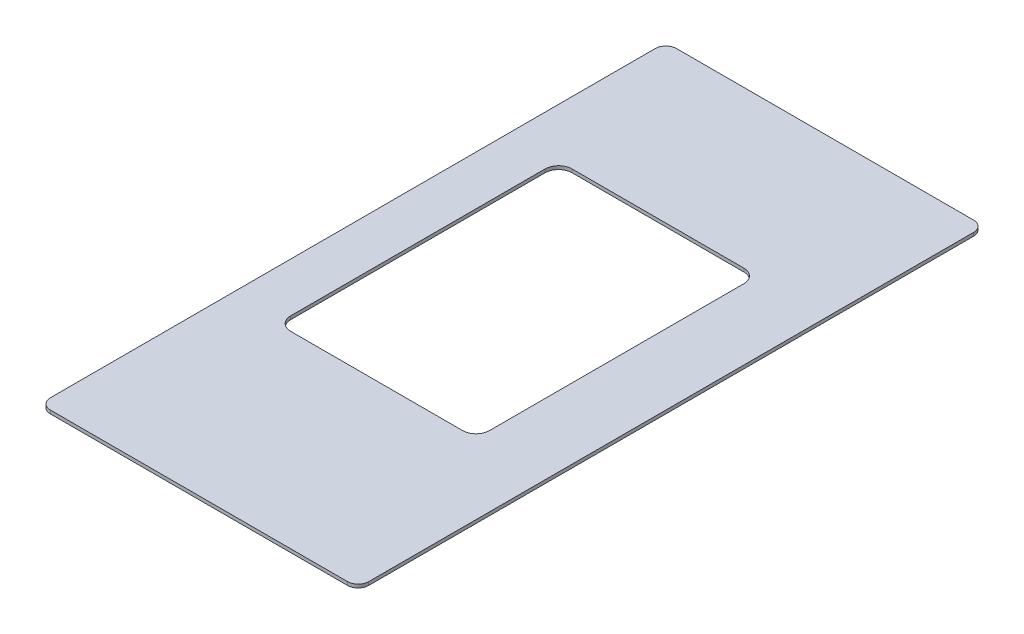
ISO-10303-21;
HEADER;
FILE_DESCRIPTION(('STEP AP214'),'2;1');
FILE_NAME('part.step','',(''),(''),'','','');
FILE_SCHEMA(('AUTOMOTIVE_DESIGN { 1 0 10303 214 1 1 1 1 }'));
ENDSEC;
DATA;
#1=APPLICATION_CONTEXT('core data for automotive mechanical design processes');
#2=APPLICATION_PROTOCOL_DEFINITION('international standard','automotive_design',2000,#1);
#3=PRODUCT_CONTEXT('',#1,'mechanical');
#4=PRODUCT('Part','Part','',(#3));
#5=PRODUCT_RELATED_PRODUCT_CATEGORY('part','',(#4));
#6=PRODUCT_DEFINITION_FORMATION('','',#4);
#7=PRODUCT_DEFINITION_CONTEXT('part definition',#1,'design');
#8=PRODUCT_DEFINITION('design','',#6,#7);
#9=PRODUCT_DEFINITION_SHAPE('','',#8);
#10=(LENGTH_UNIT() NAMED_UNIT(*) SI_UNIT(.MILLI.,.METRE.));
#11=(NAMED_UNIT(*) PLANE_ANGLE_UNIT() SI_UNIT($,.RADIAN.));
#12=(NAMED_UNIT(*) SI_UNIT($,.STERADIAN.) SOLID_ANGLE_UNIT());
#13=UNCERTAINTY_MEASURE_WITH_UNIT(LENGTH_MEASURE(1.E-05),#10,'distance_accuracy_value','');
#14=(GEOMETRIC_REPRESENTATION_CONTEXT(3) GLOBAL_UNCERTAINTY_ASSIGNED_CONTEXT((#13)) GLOBAL_UNIT_ASSIGNED_CONTEXT((#10,
#11,#12)) REPRESENTATION_CONTEXT('',''));
#15=CARTESIAN_POINT('',(0.,0.,0.));
#16=DIRECTION('',(0.,0.,1.));
#17=DIRECTION('',(1.,0.,0.));
#18=AXIS2_PLACEMENT_3D('',#15,#16,#17);
#19=CARTESIAN_POINT('',(0.,3.175,-157.44375));
#20=DIRECTION('',(0.,0.,1.));
#21=DIRECTION('',(1.,0.,0.));
#22=AXIS2_PLACEMENT_3D('',#19,#20,#21);
#23=PLANE('',#22);
#24=DIRECTION('',(-1.,0.,0.));
#25=VECTOR('',#24,1.);
#26=CARTESIAN_POINT('',(0.,0.,-157.44375));
#27=LINE('',#26,#25);
#28=CARTESIAN_POINT('',(70.9624999999999,0.,-157.44375));
#29=VERTEX_POINT('',#28);
#30=CARTESIAN_POINT('',(-90.9625000000001,0.,-157.44375));
#31=VERTEX_POINT('',#30);
#32=EDGE_CURVE('E189',#29,#31,#27,.T.);
#33=ORIENTED_EDGE('',*,*,#32,.T.);
#34=DIRECTION('',(0.,-1.,0.));
#35=VECTOR('',#34,1.);
#36=CARTESIAN_POINT('',(-90.9625000000001,3.175,-157.44375));
#37=LINE('',#36,#35);
#38=CARTESIAN_POINT('',(-90.9625000000001,3.175,-157.44375));
#39=VERTEX_POINT('',#38);
#40=EDGE_CURVE('E236',#31,#39,#37,.F.);
#41=ORIENTED_EDGE('',*,*,#40,.T.);
#42=DIRECTION('',(-1.,0.,0.));
#43=VECTOR('',#42,1.);
#44=CARTESIAN_POINT('',(0.,3.175,-157.44375));
#45=LINE('',#44,#43);
#46=CARTESIAN_POINT('',(70.9624999999999,3.175,-157.44375));
#47=VERTEX_POINT('',#46);
#48=EDGE_CURVE('E273',#47,#39,#45,.T.);
#49=ORIENTED_EDGE('',*,*,#48,.F.);
#50=DIRECTION('',(0.,-1.,0.));
#51=VECTOR('',#50,1.);
#52=CARTESIAN_POINT('',(70.9624999999999,3.175,-157.44375));
#53=LINE('',#52,#51);
#54=EDGE_CURVE('E233',#47,#29,#53,.T.);
#55=ORIENTED_EDGE('',*,*,#54,.T.);
#56=EDGE_LOOP('',(#33,#41,#49,#55));
#57=FACE_BOUND('',#56,.T.);
#58=ADVANCED_FACE('F37',(#57),#23,.F.);
#59=CARTESIAN_POINT('',(-103.6625,3.175,0.));
#60=DIRECTION('',(-1.,0.,0.));
#61=DIRECTION('',(0.,0.,1.));
#62=AXIS2_PLACEMENT_3D('',#59,#60,#61);
#63=PLANE('',#62);
#64=DIRECTION('',(0.,0.,-1.));
#65=VECTOR('',#64,1.);
#66=CARTESIAN_POINT('',(-103.6625,3.175,0.));
#67=LINE('',#66,#65);
#68=CARTESIAN_POINT('',(-103.6625,3.175,-170.14375));
#69=VERTEX_POINT('',#68);
#70=CARTESIAN_POINT('',(-103.6625,3.175,-409.85625));
#71=VERTEX_POINT('',#70);
#72=EDGE_CURVE('E270',#69,#71,#67,.T.);
#73=ORIENTED_EDGE('',*,*,#72,.F.);
#74=DIRECTION('',(0.,-1.,0.));
#75=VECTOR('',#74,1.);
#76=CARTESIAN_POINT('',(-103.6625,0.,-170.14375));
#77=LINE('',#76,#75);
#78=CARTESIAN_POINT('',(-103.6625,0.,-170.14375));
#79=VERTEX_POINT('',#78);
#80=EDGE_CURVE('E230',#69,#79,#77,.T.);
#81=ORIENTED_EDGE('',*,*,#80,.T.);
#82=DIRECTION('',(0.,0.,-1.));
#83=VECTOR('',#82,1.);
#84=CARTESIAN_POINT('',(-103.6625,0.,0.));
#85=LINE('',#84,#83);
#86=CARTESIAN_POINT('',(-103.6625,0.,-409.85625));
#87=VERTEX_POINT('',#86);
#88=EDGE_CURVE('E192',#79,#87,#85,.T.);
#89=ORIENTED_EDGE('',*,*,#88,.T.);
#90=DIRECTION('',(0.,-1.,0.));
#91=VECTOR('',#90,1.);
#92=CARTESIAN_POINT('',(-103.6625,3.175,-409.85625));
#93=LINE('',#92,#91);
#94=EDGE_CURVE('E228',#87,#71,#93,.F.);
#95=ORIENTED_EDGE('',*,*,#94,.T.);
#96=EDGE_LOOP('',(#73,#81,#89,#95));
#97=FACE_BOUND('',#96,.T.);
#98=ADVANCED_FACE('F265',(#97),#63,.F.);
#99=CARTESIAN_POINT('',(-1.25218651527896E-13,3.175,-422.55625));
#100=DIRECTION('',(0.,0.,1.));
#101=DIRECTION('',(1.,0.,0.));
#102=AXIS2_PLACEMENT_3D('',#99,#100,#101);
#103=PLANE('',#102);
#104=DIRECTION('',(-1.,0.,0.));
#105=VECTOR('',#104,1.);
#106=CARTESIAN_POINT('',(-1.25218651527896E-13,0.,-422.55625));
#107=LINE('',#106,#105);
#108=CARTESIAN_POINT('',(70.9624999999999,0.,-422.55625));
#109=VERTEX_POINT('',#108);
#110=CARTESIAN_POINT('',(-90.9625000000001,0.,-422.55625));
#111=VERTEX_POINT('',#110);
#112=EDGE_CURVE('E195',#109,#111,#107,.T.);
#113=ORIENTED_EDGE('',*,*,#112,.F.);
#114=DIRECTION('',(0.,-1.,0.));
#115=VECTOR('',#114,1.);
#116=CARTESIAN_POINT('',(70.9624999999999,3.175,-422.55625));
#117=LINE('',#116,#115);
#118=CARTESIAN_POINT('',(70.9624999999999,3.175,-422.55625));
#119=VERTEX_POINT('',#118);
#120=EDGE_CURVE('E57',#109,#119,#117,.F.);
#121=ORIENTED_EDGE('',*,*,#120,.T.);
#122=DIRECTION('',(-1.,0.,0.));
#123=VECTOR('',#122,1.);
#124=CARTESIAN_POINT('',(-1.25218651527896E-13,3.175,-422.55625));
#125=LINE('',#124,#123);
#126=CARTESIAN_POINT('',(-90.9625000000001,3.175,-422.55625));
#127=VERTEX_POINT('',#126);
#128=EDGE_CURVE('E268',#119,#127,#125,.T.);
#129=ORIENTED_EDGE('',*,*,#128,.T.);
#130=DIRECTION('',(0.,-1.,0.));
#131=VECTOR('',#130,1.);
#132=CARTESIAN_POINT('',(-90.9625000000001,3.175,-422.55625));
#133=LINE('',#132,#131);
#134=EDGE_CURVE('E243',#127,#111,#133,.T.);
#135=ORIENTED_EDGE('',*,*,#134,.T.);
#136=EDGE_LOOP('',(#113,#121,#129,#135));
#137=FACE_BOUND('',#136,.T.);
#138=ADVANCED_FACE('F267',(#137),#103,.T.);
#139=CARTESIAN_POINT('',(0.,3.175,-570.));
#140=DIRECTION('',(0.,0.,-1.));
#141=DIRECTION('',(-1.,0.,0.));
#142=AXIS2_PLACEMENT_3D('',#139,#140,#141);
#143=PLANE('',#142);
#144=DIRECTION('',(1.,0.,0.));
#145=VECTOR('',#144,1.);
#146=CARTESIAN_POINT('',(0.,0.,-570.));
#147=LINE('',#146,#145);
#148=CARTESIAN_POINT('',(-140.,0.,-570.));
#149=VERTEX_POINT('',#148);
#150=CARTESIAN_POINT('',(140.,0.,-570.));
#151=VERTEX_POINT('',#150);
#152=EDGE_CURVE('E179',#149,#151,#147,.T.);
#153=ORIENTED_EDGE('',*,*,#152,.F.);
#154=DIRECTION('',(0.,-1.,0.));
#155=VECTOR('',#154,1.);
#156=CARTESIAN_POINT('',(-140.,3.175,-570.));
#157=LINE('',#156,#155);
#158=CARTESIAN_POINT('',(-140.,3.175,-570.));
#159=VERTEX_POINT('',#158);
#160=EDGE_CURVE('E155',#149,#159,#157,.F.);
#161=ORIENTED_EDGE('',*,*,#160,.T.);
#162=DIRECTION('',(1.,0.,0.));
#163=VECTOR('',#162,1.);
#164=CARTESIAN_POINT('',(0.,3.175,-570.));
#165=LINE('',#164,#163);
#166=CARTESIAN_POINT('',(140.,3.175,-570.));
#167=VERTEX_POINT('',#166);
#168=EDGE_CURVE('E201',#159,#167,#165,.T.);
#169=ORIENTED_EDGE('',*,*,#168,.T.);
#170=DIRECTION('',(0.,-1.,0.));
#171=VECTOR('',#170,1.);
#172=CARTESIAN_POINT('',(140.,3.175,-570.));
#173=LINE('',#172,#171);
#174=EDGE_CURVE('E160',#167,#151,#173,.T.);
#175=ORIENTED_EDGE('',*,*,#174,.T.);
#176=EDGE_LOOP('',(#153,#161,#169,#175));
#177=FACE_BOUND('',#176,.T.);
#178=ADVANCED_FACE('F289',(#177),#143,.T.);
#179=CARTESIAN_POINT('',(-150.,3.175,0.));
#180=DIRECTION('',(1.,0.,0.));
#181=DIRECTION('',(0.,0.,-1.));
#182=AXIS2_PLACEMENT_3D('',#179,#180,#181);
#183=PLANE('',#182);
#184=DIRECTION('',(0.,0.,1.));
#185=VECTOR('',#184,1.);
#186=CARTESIAN_POINT('',(-150.,3.175,0.));
#187=LINE('',#186,#185);
#188=CARTESIAN_POINT('',(-150.,3.175,-560.));
#189=VERTEX_POINT('',#188);
#190=CARTESIAN_POINT('',(-150.,3.175,10.));
#191=VERTEX_POINT('',#190);
#192=EDGE_CURVE('E170',#189,#191,#187,.T.);
#193=ORIENTED_EDGE('',*,*,#192,.F.);
#194=DIRECTION('',(0.,-1.,0.));
#195=VECTOR('',#194,1.);
#196=CARTESIAN_POINT('',(-150.,0.,-560.));
#197=LINE('',#196,#195);
#198=CARTESIAN_POINT('',(-150.,0.,-560.));
#199=VERTEX_POINT('',#198);
#200=EDGE_CURVE('E154',#189,#199,#197,.T.);
#201=ORIENTED_EDGE('',*,*,#200,.T.);
#202=DIRECTION('',(0.,0.,1.));
#203=VECTOR('',#202,1.);
#204=CARTESIAN_POINT('',(-150.,0.,0.));
#205=LINE('',#204,#203);
#206=CARTESIAN_POINT('',(-150.,0.,10.));
#207=VERTEX_POINT('',#206);
#208=EDGE_CURVE('E167',#199,#207,#205,.T.);
#209=ORIENTED_EDGE('',*,*,#208,.T.);
#210=DIRECTION('',(0.,-1.,0.));
#211=VECTOR('',#210,1.);
#212=CARTESIAN_POINT('',(-150.,3.175,10.));
#213=LINE('',#212,#211);
#214=EDGE_CURVE('E172',#207,#191,#213,.F.);
#215=ORIENTED_EDGE('',*,*,#214,.T.);
#216=EDGE_LOOP('',(#193,#201,#209,#215));
#217=FACE_BOUND('',#216,.T.);
#218=ADVANCED_FACE('F166',(#217),#183,.F.);
#219=CARTESIAN_POINT('',(0.,3.175,20.));
#220=DIRECTION('',(0.,0.,-1.));
#221=DIRECTION('',(-1.,0.,0.));
#222=AXIS2_PLACEMENT_3D('',#219,#220,#221);
#223=PLANE('',#222);
#224=DIRECTION('',(1.,0.,0.));
#225=VECTOR('',#224,1.);
#226=CARTESIAN_POINT('',(0.,3.175,20.));
#227=LINE('',#226,#225);
#228=CARTESIAN_POINT('',(-140.,3.175,20.));
#229=VERTEX_POINT('',#228);
#230=CARTESIAN_POINT('',(140.,3.175,20.));
#231=VERTEX_POINT('',#230);
#232=EDGE_CURVE('E281',#229,#231,#227,.T.);
#233=ORIENTED_EDGE('',*,*,#232,.F.);
#234=DIRECTION('',(0.,-1.,0.));
#235=VECTOR('',#234,1.);
#236=CARTESIAN_POINT('',(-140.,3.175,20.));
#237=LINE('',#236,#235);
#238=CARTESIAN_POINT('',(-140.,0.,20.));
#239=VERTEX_POINT('',#238);
#240=EDGE_CURVE('E225',#229,#239,#237,.T.);
#241=ORIENTED_EDGE('',*,*,#240,.T.);
#242=DIRECTION('',(1.,0.,0.));
#243=VECTOR('',#242,1.);
#244=CARTESIAN_POINT('',(0.,0.,20.));
#245=LINE('',#244,#243);
#246=CARTESIAN_POINT('',(140.,0.,20.));
#247=VERTEX_POINT('',#246);
#248=EDGE_CURVE('E178',#239,#247,#245,.T.);
#249=ORIENTED_EDGE('',*,*,#248,.T.);
#250=DIRECTION('',(0.,-1.,0.));
#251=VECTOR('',#250,1.);
#252=CARTESIAN_POINT('',(140.,3.175,20.));
#253=LINE('',#252,#251);
#254=EDGE_CURVE('E223',#247,#231,#253,.F.);
#255=ORIENTED_EDGE('',*,*,#254,.T.);
#256=EDGE_LOOP('',(#233,#241,#249,#255));
#257=FACE_BOUND('',#256,.T.);
#258=ADVANCED_FACE('F306',(#257),#223,.F.);
#259=CARTESIAN_POINT('',(150.,3.175,0.));
#260=DIRECTION('',(1.,0.,0.));
#261=DIRECTION('',(0.,0.,-1.));
#262=AXIS2_PLACEMENT_3D('',#259,#260,#261);
#263=PLANE('',#262);
#264=DIRECTION('',(0.,0.,1.));
#265=VECTOR('',#264,1.);
#266=CARTESIAN_POINT('',(150.,0.,0.));
#267=LINE('',#266,#265);
#268=CARTESIAN_POINT('',(150.,0.,-560.));
#269=VERTEX_POINT('',#268);
#270=CARTESIAN_POINT('',(150.,0.,10.));
#271=VERTEX_POINT('',#270);
#272=EDGE_CURVE('E182',#269,#271,#267,.T.);
#273=ORIENTED_EDGE('',*,*,#272,.F.);
#274=DIRECTION('',(0.,-1.,0.));
#275=VECTOR('',#274,1.);
#276=CARTESIAN_POINT('',(150.,3.175,-560.));
#277=LINE('',#276,#275);
#278=CARTESIAN_POINT('',(150.,3.175,-560.));
#279=VERTEX_POINT('',#278);
#280=EDGE_CURVE('E221',#269,#279,#277,.F.);
#281=ORIENTED_EDGE('',*,*,#280,.T.);
#282=DIRECTION('',(0.,0.,1.));
#283=VECTOR('',#282,1.);
#284=CARTESIAN_POINT('',(150.,3.175,0.));
#285=LINE('',#284,#283);
#286=CARTESIAN_POINT('',(150.,3.175,10.));
#287=VERTEX_POINT('',#286);
#288=EDGE_CURVE('E278',#279,#287,#285,.T.);
#289=ORIENTED_EDGE('',*,*,#288,.T.);
#290=DIRECTION('',(0.,-1.,0.));
#291=VECTOR('',#290,1.);
#292=CARTESIAN_POINT('',(150.,0.,10.));
#293=LINE('',#292,#291);
#294=EDGE_CURVE('E218',#287,#271,#293,.T.);
#295=ORIENTED_EDGE('',*,*,#294,.T.);
#296=EDGE_LOOP('',(#273,#281,#289,#295));
#297=FACE_BOUND('',#296,.T.);
#298=ADVANCED_FACE('F297',(#297),#263,.T.);
#299=CARTESIAN_POINT('',(83.6624999999999,3.175,0.));
#300=DIRECTION('',(-1.,0.,0.));
#301=DIRECTION('',(0.,0.,1.));
#302=AXIS2_PLACEMENT_3D('',#299,#300,#301);
#303=PLANE('',#302);
#304=DIRECTION('',(0.,0.,-1.));
#305=VECTOR('',#304,1.);
#306=CARTESIAN_POINT('',(83.6624999999999,0.,0.));
#307=LINE('',#306,#305);
#308=CARTESIAN_POINT('',(83.6624999999999,0.,-170.14375));
#309=VERTEX_POINT('',#308);
#310=CARTESIAN_POINT('',(83.6624999999999,0.,-409.85625));
#311=VERTEX_POINT('',#310);
#312=EDGE_CURVE('E198',#309,#311,#307,.T.);
#313=ORIENTED_EDGE('',*,*,#312,.F.);
#314=DIRECTION('',(0.,-1.,0.));
#315=VECTOR('',#314,1.);
#316=CARTESIAN_POINT('',(83.6624999999999,3.175,-170.14375));
#317=LINE('',#316,#315);
#318=CARTESIAN_POINT('',(83.6624999999999,3.175,-170.14375));
#319=VERTEX_POINT('',#318);
#320=EDGE_CURVE('E241',#309,#319,#317,.F.);
#321=ORIENTED_EDGE('',*,*,#320,.T.);
#322=DIRECTION('',(0.,0.,-1.));
#323=VECTOR('',#322,1.);
#324=CARTESIAN_POINT('',(83.6624999999999,3.175,0.));
#325=LINE('',#324,#323);
#326=CARTESIAN_POINT('',(83.6624999999999,3.175,-409.85625));
#327=VERTEX_POINT('',#326);
#328=EDGE_CURVE('E202',#319,#327,#325,.T.);
#329=ORIENTED_EDGE('',*,*,#328,.T.);
#330=DIRECTION('',(0.,-1.,0.));
#331=VECTOR('',#330,1.);
#332=CARTESIAN_POINT('',(83.6624999999999,0.,-409.85625));
#333=LINE('',#332,#331);
#334=EDGE_CURVE('E238',#327,#311,#333,.T.);
#335=ORIENTED_EDGE('',*,*,#334,.T.);
#336=EDGE_LOOP('',(#313,#321,#329,#335));
#337=FACE_BOUND('',#336,.T.);
#338=ADVANCED_FACE('F313',(#337),#303,.T.);
#339=CARTESIAN_POINT('',(0.,3.175,0.));
#340=DIRECTION('',(0.,1.,0.));
#341=DIRECTION('',(0.,0.,1.));
#342=AXIS2_PLACEMENT_3D('',#339,#340,#341);
#343=PLANE('',#342);
#344=ORIENTED_EDGE('',*,*,#168,.F.);
#345=CARTESIAN_POINT('',(-140.,3.175,-560.));
#346=DIRECTION('',(0.,1.,0.));
#347=DIRECTION('',(0.,0.,1.));
#348=AXIS2_PLACEMENT_3D('',#345,#346,#347);
#349=CIRCLE('',#348,10.);
#350=EDGE_CURVE('E216',#159,#189,#349,.T.);
#351=ORIENTED_EDGE('',*,*,#350,.T.);
#352=ORIENTED_EDGE('',*,*,#192,.T.);
#353=CARTESIAN_POINT('',(-140.,3.175,10.));
#354=DIRECTION('',(0.,1.,0.));
#355=DIRECTION('',(0.,0.,1.));
#356=AXIS2_PLACEMENT_3D('',#353,#354,#355);
#357=CIRCLE('',#356,10.);
#358=EDGE_CURVE('E212',#191,#229,#357,.T.);
#359=ORIENTED_EDGE('',*,*,#358,.T.);
#360=ORIENTED_EDGE('',*,*,#232,.T.);
#361=CARTESIAN_POINT('',(140.,3.175,10.));
#362=DIRECTION('',(0.,1.,0.));
#363=DIRECTION('',(0.,0.,1.));
#364=AXIS2_PLACEMENT_3D('',#361,#362,#363);
#365=CIRCLE('',#364,10.);
#366=EDGE_CURVE('E210',#231,#287,#365,.T.);
#367=ORIENTED_EDGE('',*,*,#366,.T.);
#368=ORIENTED_EDGE('',*,*,#288,.F.);
#369=CARTESIAN_POINT('',(140.,3.175,-560.));
#370=DIRECTION('',(0.,1.,0.));
#371=DIRECTION('',(0.,0.,1.));
#372=AXIS2_PLACEMENT_3D('',#369,#370,#371);
#373=CIRCLE('',#372,10.);
#374=EDGE_CURVE('E214',#279,#167,#373,.T.);
#375=ORIENTED_EDGE('',*,*,#374,.T.);
#376=EDGE_LOOP('',(#344,#351,#352,#359,#360,#367,#368,#375));
#377=FACE_BOUND('',#376,.T.);
#378=ORIENTED_EDGE('',*,*,#328,.F.);
#379=CARTESIAN_POINT('',(70.9624999999999,3.175,-170.14375));
#380=DIRECTION('',(0.,1.,0.));
#381=DIRECTION('',(0.,0.,1.));
#382=AXIS2_PLACEMENT_3D('',#379,#380,#381);
#383=CIRCLE('',#382,12.7);
#384=EDGE_CURVE('E253',#319,#47,#383,.F.);
#385=ORIENTED_EDGE('',*,*,#384,.T.);
#386=ORIENTED_EDGE('',*,*,#48,.T.);
#387=CARTESIAN_POINT('',(-90.9625000000001,3.175,-170.14375));
#388=DIRECTION('',(0.,1.,0.));
#389=DIRECTION('',(0.,0.,1.));
#390=AXIS2_PLACEMENT_3D('',#387,#388,#389);
#391=CIRCLE('',#390,12.7);
#392=EDGE_CURVE('E249',#39,#69,#391,.F.);
#393=ORIENTED_EDGE('',*,*,#392,.T.);
#394=ORIENTED_EDGE('',*,*,#72,.T.);
#395=CARTESIAN_POINT('',(-90.9625000000001,3.175,-409.85625));
#396=DIRECTION('',(0.,1.,0.));
#397=DIRECTION('',(0.,0.,1.));
#398=AXIS2_PLACEMENT_3D('',#395,#396,#397);
#399=CIRCLE('',#398,12.7);
#400=EDGE_CURVE('E11',#71,#127,#399,.F.);
#401=ORIENTED_EDGE('',*,*,#400,.T.);
#402=ORIENTED_EDGE('',*,*,#128,.F.);
#403=CARTESIAN_POINT('',(70.9624999999999,3.175,-409.85625));
#404=DIRECTION('',(0.,1.,0.));
#405=DIRECTION('',(0.,0.,1.));
#406=AXIS2_PLACEMENT_3D('',#403,#404,#405);
#407=CIRCLE('',#406,12.7);
#408=EDGE_CURVE('E257',#119,#327,#407,.F.);
#409=ORIENTED_EDGE('',*,*,#408,.T.);
#410=EDGE_LOOP('',(#378,#385,#386,#393,#394,#401,#402,#409));
#411=FACE_BOUND('',#410,.T.);
#412=ADVANCED_FACE('F311',(#377,#411),#343,.T.);
#413=CARTESIAN_POINT('',(0.,0.,0.));
#414=DIRECTION('',(0.,1.,0.));
#415=DIRECTION('',(0.,0.,1.));
#416=AXIS2_PLACEMENT_3D('',#413,#414,#415);
#417=PLANE('',#416);
#418=ORIENTED_EDGE('',*,*,#208,.F.);
#419=CARTESIAN_POINT('',(-140.,0.,-560.));
#420=DIRECTION('',(0.,1.,0.));
#421=DIRECTION('',(0.,0.,1.));
#422=AXIS2_PLACEMENT_3D('',#419,#420,#421);
#423=CIRCLE('',#422,10.);
#424=EDGE_CURVE('E150',#199,#149,#423,.F.);
#425=ORIENTED_EDGE('',*,*,#424,.T.);
#426=ORIENTED_EDGE('',*,*,#152,.T.);
#427=CARTESIAN_POINT('',(140.,0.,-560.));
#428=DIRECTION('',(0.,1.,0.));
#429=DIRECTION('',(0.,0.,1.));
#430=AXIS2_PLACEMENT_3D('',#427,#428,#429);
#431=CIRCLE('',#430,10.);
#432=EDGE_CURVE('E161',#151,#269,#431,.F.);
#433=ORIENTED_EDGE('',*,*,#432,.T.);
#434=ORIENTED_EDGE('',*,*,#272,.T.);
#435=CARTESIAN_POINT('',(140.,0.,10.));
#436=DIRECTION('',(0.,1.,0.));
#437=DIRECTION('',(0.,0.,1.));
#438=AXIS2_PLACEMENT_3D('',#435,#436,#437);
#439=CIRCLE('',#438,10.);
#440=EDGE_CURVE('E171',#271,#247,#439,.F.);
#441=ORIENTED_EDGE('',*,*,#440,.T.);
#442=ORIENTED_EDGE('',*,*,#248,.F.);
#443=CARTESIAN_POINT('',(-140.,0.,10.));
#444=DIRECTION('',(0.,1.,0.));
#445=DIRECTION('',(0.,0.,1.));
#446=AXIS2_PLACEMENT_3D('',#443,#444,#445);
#447=CIRCLE('',#446,10.);
#448=EDGE_CURVE('E177',#239,#207,#447,.F.);
#449=ORIENTED_EDGE('',*,*,#448,.T.);
#450=EDGE_LOOP('',(#418,#425,#426,#433,#434,#441,#442,#449));
#451=FACE_BOUND('',#450,.T.);
#452=ORIENTED_EDGE('',*,*,#32,.F.);
#453=CARTESIAN_POINT('',(70.9624999999999,0.,-170.14375));
#454=DIRECTION('',(0.,1.,0.));
#455=DIRECTION('',(0.,0.,1.));
#456=AXIS2_PLACEMENT_3D('',#453,#454,#455);
#457=CIRCLE('',#456,12.7);
#458=EDGE_CURVE('E251',#29,#309,#457,.T.);
#459=ORIENTED_EDGE('',*,*,#458,.T.);
#460=ORIENTED_EDGE('',*,*,#312,.T.);
#461=CARTESIAN_POINT('',(70.9624999999999,0.,-409.85625));
#462=DIRECTION('',(0.,1.,0.));
#463=DIRECTION('',(0.,0.,1.));
#464=AXIS2_PLACEMENT_3D('',#461,#462,#463);
#465=CIRCLE('',#464,12.7);
#466=EDGE_CURVE('E255',#311,#109,#465,.T.);
#467=ORIENTED_EDGE('',*,*,#466,.T.);
#468=ORIENTED_EDGE('',*,*,#112,.T.);
#469=CARTESIAN_POINT('',(-90.9625000000001,0.,-409.85625));
#470=DIRECTION('',(0.,1.,0.));
#471=DIRECTION('',(0.,0.,1.));
#472=AXIS2_PLACEMENT_3D('',#469,#470,#471);
#473=CIRCLE('',#472,12.7);
#474=EDGE_CURVE('E45',#111,#87,#473,.T.);
#475=ORIENTED_EDGE('',*,*,#474,.T.);
#476=ORIENTED_EDGE('',*,*,#88,.F.);
#477=CARTESIAN_POINT('',(-90.9625000000001,0.,-170.14375));
#478=DIRECTION('',(0.,1.,0.));
#479=DIRECTION('',(0.,0.,1.));
#480=AXIS2_PLACEMENT_3D('',#477,#478,#479);
#481=CIRCLE('',#480,12.7);
#482=EDGE_CURVE('E247',#79,#31,#481,.T.);
#483=ORIENTED_EDGE('',*,*,#482,.T.);
#484=EDGE_LOOP('',(#452,#459,#460,#467,#468,#475,#476,#483));
#485=FACE_BOUND('',#484,.T.);
#486=ADVANCED_FACE('F174',(#451,#485),#417,.F.);
#487=CARTESIAN_POINT('',(-140.,3.175,-560.));
#488=DIRECTION('',(0.,1.,0.));
#489=DIRECTION('',(0.,0.,1.));
#490=AXIS2_PLACEMENT_3D('',#487,#488,#489);
#491=CYLINDRICAL_SURFACE('',#490,10.);
#492=ORIENTED_EDGE('',*,*,#350,.F.);
#493=ORIENTED_EDGE('',*,*,#160,.F.);
#494=ORIENTED_EDGE('',*,*,#424,.F.);
#495=ORIENTED_EDGE('',*,*,#200,.F.);
#496=EDGE_LOOP('',(#492,#493,#494,#495));
#497=FACE_BOUND('',#496,.T.);
#498=ADVANCED_FACE('F153',(#497),#491,.T.);
#499=CARTESIAN_POINT('',(140.,3.175,-560.));
#500=DIRECTION('',(0.,-1.,0.));
#501=DIRECTION('',(0.,0.,-1.));
#502=AXIS2_PLACEMENT_3D('',#499,#500,#501);
#503=CYLINDRICAL_SURFACE('',#502,10.);
#504=ORIENTED_EDGE('',*,*,#374,.F.);
#505=ORIENTED_EDGE('',*,*,#280,.F.);
#506=ORIENTED_EDGE('',*,*,#432,.F.);
#507=ORIENTED_EDGE('',*,*,#174,.F.);
#508=EDGE_LOOP('',(#504,#505,#506,#507));
#509=FACE_BOUND('',#508,.T.);
#510=ADVANCED_FACE('F293',(#509),#503,.T.);
#511=CARTESIAN_POINT('',(-140.,3.175,10.));
#512=DIRECTION('',(0.,-1.,0.));
#513=DIRECTION('',(0.,0.,-1.));
#514=AXIS2_PLACEMENT_3D('',#511,#512,#513);
#515=CYLINDRICAL_SURFACE('',#514,10.);
#516=ORIENTED_EDGE('',*,*,#358,.F.);
#517=ORIENTED_EDGE('',*,*,#214,.F.);
#518=ORIENTED_EDGE('',*,*,#448,.F.);
#519=ORIENTED_EDGE('',*,*,#240,.F.);
#520=EDGE_LOOP('',(#516,#517,#518,#519));
#521=FACE_BOUND('',#520,.T.);
#522=ADVANCED_FACE('F310',(#521),#515,.T.);
#523=CARTESIAN_POINT('',(140.,3.175,10.));
#524=DIRECTION('',(0.,1.,0.));
#525=DIRECTION('',(0.,0.,1.));
#526=AXIS2_PLACEMENT_3D('',#523,#524,#525);
#527=CYLINDRICAL_SURFACE('',#526,10.);
#528=ORIENTED_EDGE('',*,*,#366,.F.);
#529=ORIENTED_EDGE('',*,*,#254,.F.);
#530=ORIENTED_EDGE('',*,*,#440,.F.);
#531=ORIENTED_EDGE('',*,*,#294,.F.);
#532=EDGE_LOOP('',(#528,#529,#530,#531));
#533=FACE_BOUND('',#532,.T.);
#534=ADVANCED_FACE('F302',(#533),#527,.T.);
#535=CARTESIAN_POINT('',(-90.9625000000001,3.175,-170.14375));
#536=DIRECTION('',(0.,1.,0.));
#537=DIRECTION('',(0.,0.,1.));
#538=AXIS2_PLACEMENT_3D('',#535,#536,#537);
#539=CYLINDRICAL_SURFACE('',#538,12.7);
#540=ORIENTED_EDGE('',*,*,#392,.F.);
#541=ORIENTED_EDGE('',*,*,#40,.F.);
#542=ORIENTED_EDGE('',*,*,#482,.F.);
#543=ORIENTED_EDGE('',*,*,#80,.F.);
#544=EDGE_LOOP('',(#540,#541,#542,#543));
#545=FACE_BOUND('',#544,.T.);
#546=ADVANCED_FACE('F329',(#545),#539,.F.);
#547=CARTESIAN_POINT('',(70.9624999999999,3.175,-170.14375));
#548=DIRECTION('',(0.,-1.,0.));
#549=DIRECTION('',(0.,0.,-1.));
#550=AXIS2_PLACEMENT_3D('',#547,#548,#549);
#551=CYLINDRICAL_SURFACE('',#550,12.7);
#552=ORIENTED_EDGE('',*,*,#384,.F.);
#553=ORIENTED_EDGE('',*,*,#320,.F.);
#554=ORIENTED_EDGE('',*,*,#458,.F.);
#555=ORIENTED_EDGE('',*,*,#54,.F.);
#556=EDGE_LOOP('',(#552,#553,#554,#555));
#557=FACE_BOUND('',#556,.T.);
#558=ADVANCED_FACE('F323',(#557),#551,.F.);
#559=CARTESIAN_POINT('',(70.9624999999999,3.175,-409.85625));
#560=DIRECTION('',(0.,1.,0.));
#561=DIRECTION('',(0.,0.,1.));
#562=AXIS2_PLACEMENT_3D('',#559,#560,#561);
#563=CYLINDRICAL_SURFACE('',#562,12.7);
#564=ORIENTED_EDGE('',*,*,#408,.F.);
#565=ORIENTED_EDGE('',*,*,#120,.F.);
#566=ORIENTED_EDGE('',*,*,#466,.F.);
#567=ORIENTED_EDGE('',*,*,#334,.F.);
#568=EDGE_LOOP('',(#564,#565,#566,#567));
#569=FACE_BOUND('',#568,.T.);
#570=ADVANCED_FACE('F336',(#569),#563,.F.);
#571=CARTESIAN_POINT('',(-90.9625000000001,3.175,-409.85625));
#572=DIRECTION('',(0.,-1.,0.));
#573=DIRECTION('',(0.,0.,-1.));
#574=AXIS2_PLACEMENT_3D('',#571,#572,#573);
#575=CYLINDRICAL_SURFACE('',#574,12.7);
#576=ORIENTED_EDGE('',*,*,#400,.F.);
#577=ORIENTED_EDGE('',*,*,#94,.F.);
#578=ORIENTED_EDGE('',*,*,#474,.F.);
#579=ORIENTED_EDGE('',*,*,#134,.F.);
#580=EDGE_LOOP('',(#576,#577,#578,#579));
#581=FACE_BOUND('',#580,.T.);
#582=ADVANCED_FACE('F39',(#581),#575,.F.);
#583=CLOSED_SHELL('',(#58,#98,#138,#178,#218,#258,#298,#338,#412,#486,#498,#510,#522,#534,#546,
#558,#570,#582));
#584=MANIFOLD_SOLID_BREP('B2',#583);
#585=ADVANCED_BREP_SHAPE_REPRESENTATION('',(#18,#584),#14);
#586=SHAPE_DEFINITION_REPRESENTATION(#9,#585);
ENDSEC;
END-ISO-10303-21;
